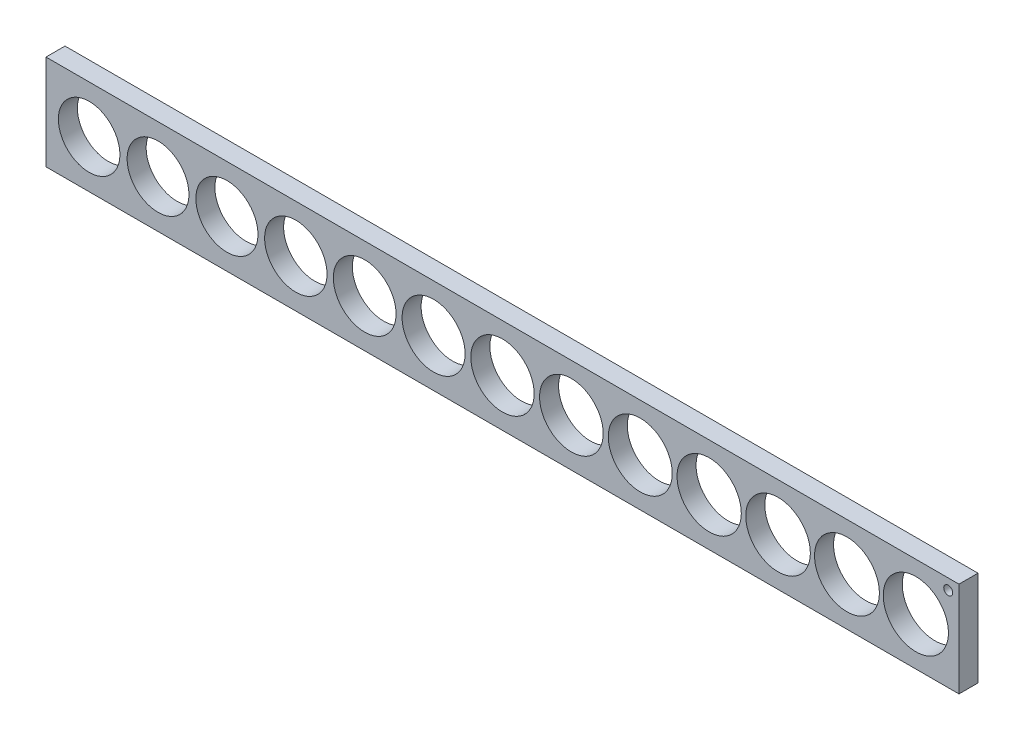
ISO-10303-21;
HEADER;
FILE_DESCRIPTION(('STEP AP214'),'2;1');
FILE_NAME('part.step','',(''),(''),'','','');
FILE_SCHEMA(('AUTOMOTIVE_DESIGN { 1 0 10303 214 1 1 1 1 }'));
ENDSEC;
DATA;
#1=APPLICATION_CONTEXT('core data for automotive mechanical design processes');
#2=APPLICATION_PROTOCOL_DEFINITION('international standard','automotive_design',2000,#1);
#3=PRODUCT_CONTEXT('',#1,'mechanical');
#4=PRODUCT('Part','Part','',(#3));
#5=PRODUCT_RELATED_PRODUCT_CATEGORY('part','',(#4));
#6=PRODUCT_DEFINITION_FORMATION('','',#4);
#7=PRODUCT_DEFINITION_CONTEXT('part definition',#1,'design');
#8=PRODUCT_DEFINITION('design','',#6,#7);
#9=PRODUCT_DEFINITION_SHAPE('','',#8);
#10=(LENGTH_UNIT() NAMED_UNIT(*) SI_UNIT(.MILLI.,.METRE.));
#11=(NAMED_UNIT(*) PLANE_ANGLE_UNIT() SI_UNIT($,.RADIAN.));
#12=(NAMED_UNIT(*) SI_UNIT($,.STERADIAN.) SOLID_ANGLE_UNIT());
#13=UNCERTAINTY_MEASURE_WITH_UNIT(LENGTH_MEASURE(1.E-05),#10,'distance_accuracy_value','');
#14=(GEOMETRIC_REPRESENTATION_CONTEXT(3) GLOBAL_UNCERTAINTY_ASSIGNED_CONTEXT((#13)) GLOBAL_UNIT_ASSIGNED_CONTEXT((#10,
#11,#12)) REPRESENTATION_CONTEXT('',''));
#15=CARTESIAN_POINT('',(0.,0.,0.));
#16=DIRECTION('',(0.,0.,1.));
#17=DIRECTION('',(1.,0.,0.));
#18=AXIS2_PLACEMENT_3D('',#15,#16,#17);
#19=CARTESIAN_POINT('',(0.,0.,6.35));
#20=DIRECTION('',(0.,0.,1.));
#21=DIRECTION('',(1.,0.,0.));
#22=AXIS2_PLACEMENT_3D('',#19,#20,#21);
#23=PLANE('',#22);
#24=CARTESIAN_POINT('',(-23.,0.,6.35));
#25=DIRECTION('',(0.,0.,1.));
#26=DIRECTION('',(-1.,0.,0.));
#27=AXIS2_PLACEMENT_3D('',#24,#25,#26);
#28=CIRCLE('',#27,10.5242);
#29=CARTESIAN_POINT('',(-33.5242,0.,6.35));
#30=VERTEX_POINT('',#29);
#31=EDGE_CURVE('E190',#30,#30,#28,.T.);
#32=ORIENTED_EDGE('',*,*,#31,.F.);
#33=EDGE_LOOP('',(#32));
#34=FACE_BOUND('',#33,.T.);
#35=CARTESIAN_POINT('',(-69.,0.,6.35));
#36=DIRECTION('',(0.,0.,1.));
#37=DIRECTION('',(-1.,0.,0.));
#38=AXIS2_PLACEMENT_3D('',#35,#36,#37);
#39=CIRCLE('',#38,10.4226);
#40=CARTESIAN_POINT('',(-79.4226,0.,6.35));
#41=VERTEX_POINT('',#40);
#42=EDGE_CURVE('E178',#41,#41,#39,.T.);
#43=ORIENTED_EDGE('',*,*,#42,.F.);
#44=EDGE_LOOP('',(#43));
#45=FACE_BOUND('',#44,.T.);
#46=CARTESIAN_POINT('',(-115.,0.,6.35));
#47=DIRECTION('',(0.,0.,1.));
#48=DIRECTION('',(-1.,0.,0.));
#49=AXIS2_PLACEMENT_3D('',#46,#47,#48);
#50=CIRCLE('',#49,10.321);
#51=CARTESIAN_POINT('',(-125.321,0.,6.35));
#52=VERTEX_POINT('',#51);
#53=EDGE_CURVE('E166',#52,#52,#50,.T.);
#54=ORIENTED_EDGE('',*,*,#53,.F.);
#55=EDGE_LOOP('',(#54));
#56=FACE_BOUND('',#55,.T.);
#57=CARTESIAN_POINT('',(138.,0.,6.35));
#58=DIRECTION('',(0.,0.,1.));
#59=DIRECTION('',(1.,0.,0.));
#60=AXIS2_PLACEMENT_3D('',#57,#58,#59);
#61=CIRCLE('',#60,10.8798);
#62=CARTESIAN_POINT('',(148.8798,0.,6.35));
#63=VERTEX_POINT('',#62);
#64=EDGE_CURVE('E154',#63,#63,#61,.T.);
#65=ORIENTED_EDGE('',*,*,#64,.F.);
#66=EDGE_LOOP('',(#65));
#67=FACE_BOUND('',#66,.T.);
#68=CARTESIAN_POINT('',(92.,0.,6.35));
#69=DIRECTION('',(0.,0.,1.));
#70=DIRECTION('',(1.,0.,0.));
#71=AXIS2_PLACEMENT_3D('',#68,#69,#70);
#72=CIRCLE('',#71,10.7782);
#73=CARTESIAN_POINT('',(102.7782,0.,6.35));
#74=VERTEX_POINT('',#73);
#75=EDGE_CURVE('E142',#74,#74,#72,.T.);
#76=ORIENTED_EDGE('',*,*,#75,.F.);
#77=EDGE_LOOP('',(#76));
#78=FACE_BOUND('',#77,.T.);
#79=CARTESIAN_POINT('',(46.,0.,6.35));
#80=DIRECTION('',(0.,0.,1.));
#81=DIRECTION('',(1.,0.,0.));
#82=AXIS2_PLACEMENT_3D('',#79,#80,#81);
#83=CIRCLE('',#82,10.6766);
#84=CARTESIAN_POINT('',(56.6766,0.,6.35));
#85=VERTEX_POINT('',#84);
#86=EDGE_CURVE('E130',#85,#85,#83,.T.);
#87=ORIENTED_EDGE('',*,*,#86,.F.);
#88=EDGE_LOOP('',(#87));
#89=FACE_BOUND('',#88,.T.);
#90=CARTESIAN_POINT('',(0.,0.,6.35));
#91=DIRECTION('',(0.,0.,1.));
#92=DIRECTION('',(1.,0.,0.));
#93=AXIS2_PLACEMENT_3D('',#90,#91,#92);
#94=CIRCLE('',#93,10.575);
#95=CARTESIAN_POINT('',(10.575,0.,6.35));
#96=VERTEX_POINT('',#95);
#97=EDGE_CURVE('E109',#96,#96,#94,.T.);
#98=ORIENTED_EDGE('',*,*,#97,.F.);
#99=EDGE_LOOP('',(#98));
#100=FACE_BOUND('',#99,.T.);
#101=DIRECTION('',(0.,1.,0.));
#102=VECTOR('',#101,1.);
#103=CARTESIAN_POINT('',(152.4,15.8749999999999,6.35));
#104=LINE('',#103,#102);
#105=CARTESIAN_POINT('',(152.4,-15.8750000000001,6.35));
#106=VERTEX_POINT('',#105);
#107=CARTESIAN_POINT('',(152.4,15.8749999999999,6.35));
#108=VERTEX_POINT('',#107);
#109=EDGE_CURVE('E94',#106,#108,#104,.T.);
#110=ORIENTED_EDGE('',*,*,#109,.T.);
#111=DIRECTION('',(-1.,0.,0.));
#112=VECTOR('',#111,1.);
#113=CARTESIAN_POINT('',(-152.4,15.8750000000001,6.35));
#114=LINE('',#113,#112);
#115=CARTESIAN_POINT('',(-152.4,15.8750000000001,6.35));
#116=VERTEX_POINT('',#115);
#117=EDGE_CURVE('E89',#108,#116,#114,.T.);
#118=ORIENTED_EDGE('',*,*,#117,.T.);
#119=DIRECTION('',(0.,-1.,0.));
#120=VECTOR('',#119,1.);
#121=CARTESIAN_POINT('',(-152.4,15.8750000000001,6.35));
#122=LINE('',#121,#120);
#123=CARTESIAN_POINT('',(-152.4,-15.8750000000001,6.35));
#124=VERTEX_POINT('',#123);
#125=EDGE_CURVE('E92',#116,#124,#122,.T.);
#126=ORIENTED_EDGE('',*,*,#125,.T.);
#127=DIRECTION('',(1.,0.,0.));
#128=VECTOR('',#127,1.);
#129=CARTESIAN_POINT('',(-152.4,-15.8750000000001,6.35));
#130=LINE('',#129,#128);
#131=EDGE_CURVE('E59',#124,#106,#130,.T.);
#132=ORIENTED_EDGE('',*,*,#131,.T.);
#133=EDGE_LOOP('',(#110,#118,#126,#132));
#134=FACE_BOUND('',#133,.T.);
#135=CARTESIAN_POINT('',(23.,0.,6.35));
#136=DIRECTION('',(0.,0.,1.));
#137=DIRECTION('',(1.,0.,0.));
#138=AXIS2_PLACEMENT_3D('',#135,#136,#137);
#139=CIRCLE('',#138,10.6258);
#140=CARTESIAN_POINT('',(33.6258,0.,6.35));
#141=VERTEX_POINT('',#140);
#142=EDGE_CURVE('E124',#141,#141,#139,.T.);
#143=ORIENTED_EDGE('',*,*,#142,.F.);
#144=EDGE_LOOP('',(#143));
#145=FACE_BOUND('',#144,.T.);
#146=CARTESIAN_POINT('',(69.,0.,6.35));
#147=DIRECTION('',(0.,0.,1.));
#148=DIRECTION('',(1.,0.,0.));
#149=AXIS2_PLACEMENT_3D('',#146,#147,#148);
#150=CIRCLE('',#149,10.7274);
#151=CARTESIAN_POINT('',(79.7274,0.,6.35));
#152=VERTEX_POINT('',#151);
#153=EDGE_CURVE('E136',#152,#152,#150,.T.);
#154=ORIENTED_EDGE('',*,*,#153,.F.);
#155=EDGE_LOOP('',(#154));
#156=FACE_BOUND('',#155,.T.);
#157=CARTESIAN_POINT('',(115.,0.,6.35));
#158=DIRECTION('',(0.,0.,1.));
#159=DIRECTION('',(1.,0.,0.));
#160=AXIS2_PLACEMENT_3D('',#157,#158,#159);
#161=CIRCLE('',#160,10.829);
#162=CARTESIAN_POINT('',(125.829,0.,6.35));
#163=VERTEX_POINT('',#162);
#164=EDGE_CURVE('E148',#163,#163,#161,.T.);
#165=ORIENTED_EDGE('',*,*,#164,.F.);
#166=EDGE_LOOP('',(#165));
#167=FACE_BOUND('',#166,.T.);
#168=CARTESIAN_POINT('',(-138.,0.,6.35));
#169=DIRECTION('',(0.,0.,1.));
#170=DIRECTION('',(-1.,0.,0.));
#171=AXIS2_PLACEMENT_3D('',#168,#169,#170);
#172=CIRCLE('',#171,10.2702);
#173=CARTESIAN_POINT('',(-148.2702,0.,6.35));
#174=VERTEX_POINT('',#173);
#175=EDGE_CURVE('E160',#174,#174,#172,.T.);
#176=ORIENTED_EDGE('',*,*,#175,.F.);
#177=EDGE_LOOP('',(#176));
#178=FACE_BOUND('',#177,.T.);
#179=CARTESIAN_POINT('',(-92.,0.,6.35));
#180=DIRECTION('',(0.,0.,1.));
#181=DIRECTION('',(-1.,0.,0.));
#182=AXIS2_PLACEMENT_3D('',#179,#180,#181);
#183=CIRCLE('',#182,10.3718);
#184=CARTESIAN_POINT('',(-102.3718,0.,6.35));
#185=VERTEX_POINT('',#184);
#186=EDGE_CURVE('E172',#185,#185,#183,.T.);
#187=ORIENTED_EDGE('',*,*,#186,.F.);
#188=EDGE_LOOP('',(#187));
#189=FACE_BOUND('',#188,.T.);
#190=CARTESIAN_POINT('',(-46.,0.,6.35));
#191=DIRECTION('',(0.,0.,1.));
#192=DIRECTION('',(-1.,0.,0.));
#193=AXIS2_PLACEMENT_3D('',#190,#191,#192);
#194=CIRCLE('',#193,10.4734);
#195=CARTESIAN_POINT('',(-56.4734,0.,6.35));
#196=VERTEX_POINT('',#195);
#197=EDGE_CURVE('E184',#196,#196,#194,.T.);
#198=ORIENTED_EDGE('',*,*,#197,.F.);
#199=EDGE_LOOP('',(#198));
#200=FACE_BOUND('',#199,.T.);
#201=CARTESIAN_POINT('',(148.807897551572,12.2828975515723,6.35));
#202=DIRECTION('',(0.,0.,1.));
#203=DIRECTION('',(1.,0.,0.));
#204=AXIS2_PLACEMENT_3D('',#201,#202,#203);
#205=CIRCLE('',#204,1.5);
#206=CARTESIAN_POINT('',(150.307897551572,12.2828975515723,6.35));
#207=VERTEX_POINT('',#206);
#208=EDGE_CURVE('E196',#207,#207,#205,.T.);
#209=ORIENTED_EDGE('',*,*,#208,.F.);
#210=EDGE_LOOP('',(#209));
#211=FACE_BOUND('',#210,.T.);
#212=ADVANCED_FACE('F42',(#34,#45,#56,#67,#78,#89,#100,#134,#145,#156,#167,#178,#189,#200,#211),
#23,.T.);
#213=CARTESIAN_POINT('',(0.,0.,0.));
#214=DIRECTION('',(0.,0.,1.));
#215=DIRECTION('',(1.,0.,0.));
#216=AXIS2_PLACEMENT_3D('',#213,#214,#215);
#217=PLANE('',#216);
#218=DIRECTION('',(0.,1.,0.));
#219=VECTOR('',#218,1.);
#220=CARTESIAN_POINT('',(152.4,15.8749999999999,0.));
#221=LINE('',#220,#219);
#222=CARTESIAN_POINT('',(152.4,-15.8750000000001,0.));
#223=VERTEX_POINT('',#222);
#224=CARTESIAN_POINT('',(152.4,15.8749999999999,0.));
#225=VERTEX_POINT('',#224);
#226=EDGE_CURVE('E106',#223,#225,#221,.T.);
#227=ORIENTED_EDGE('',*,*,#226,.F.);
#228=DIRECTION('',(1.,0.,0.));
#229=VECTOR('',#228,1.);
#230=CARTESIAN_POINT('',(-152.4,-15.8750000000001,0.));
#231=LINE('',#230,#229);
#232=CARTESIAN_POINT('',(-152.4,-15.8750000000001,0.));
#233=VERTEX_POINT('',#232);
#234=EDGE_CURVE('E82',#233,#223,#231,.T.);
#235=ORIENTED_EDGE('',*,*,#234,.F.);
#236=DIRECTION('',(0.,-1.,0.));
#237=VECTOR('',#236,1.);
#238=CARTESIAN_POINT('',(-152.4,15.8750000000001,0.));
#239=LINE('',#238,#237);
#240=CARTESIAN_POINT('',(-152.4,15.8750000000001,0.));
#241=VERTEX_POINT('',#240);
#242=EDGE_CURVE('E76',#241,#233,#239,.T.);
#243=ORIENTED_EDGE('',*,*,#242,.F.);
#244=DIRECTION('',(-1.,0.,0.));
#245=VECTOR('',#244,1.);
#246=CARTESIAN_POINT('',(-152.4,15.8750000000001,0.));
#247=LINE('',#246,#245);
#248=EDGE_CURVE('E98',#225,#241,#247,.T.);
#249=ORIENTED_EDGE('',*,*,#248,.F.);
#250=EDGE_LOOP('',(#227,#235,#243,#249));
#251=FACE_BOUND('',#250,.T.);
#252=CARTESIAN_POINT('',(0.,0.,0.));
#253=DIRECTION('',(0.,0.,1.));
#254=DIRECTION('',(1.,0.,0.));
#255=AXIS2_PLACEMENT_3D('',#252,#253,#254);
#256=CIRCLE('',#255,10.575);
#257=CARTESIAN_POINT('',(10.575,0.,0.));
#258=VERTEX_POINT('',#257);
#259=EDGE_CURVE('E121',#258,#258,#256,.T.);
#260=ORIENTED_EDGE('',*,*,#259,.T.);
#261=EDGE_LOOP('',(#260));
#262=FACE_BOUND('',#261,.T.);
#263=CARTESIAN_POINT('',(23.,0.,0.));
#264=DIRECTION('',(0.,0.,1.));
#265=DIRECTION('',(1.,0.,0.));
#266=AXIS2_PLACEMENT_3D('',#263,#264,#265);
#267=CIRCLE('',#266,10.6258);
#268=CARTESIAN_POINT('',(33.6258,0.,0.));
#269=VERTEX_POINT('',#268);
#270=EDGE_CURVE('E127',#269,#269,#267,.T.);
#271=ORIENTED_EDGE('',*,*,#270,.T.);
#272=EDGE_LOOP('',(#271));
#273=FACE_BOUND('',#272,.T.);
#274=CARTESIAN_POINT('',(46.,0.,0.));
#275=DIRECTION('',(0.,0.,1.));
#276=DIRECTION('',(1.,0.,0.));
#277=AXIS2_PLACEMENT_3D('',#274,#275,#276);
#278=CIRCLE('',#277,10.6766);
#279=CARTESIAN_POINT('',(56.6766,0.,0.));
#280=VERTEX_POINT('',#279);
#281=EDGE_CURVE('E133',#280,#280,#278,.T.);
#282=ORIENTED_EDGE('',*,*,#281,.T.);
#283=EDGE_LOOP('',(#282));
#284=FACE_BOUND('',#283,.T.);
#285=CARTESIAN_POINT('',(69.,0.,0.));
#286=DIRECTION('',(0.,0.,1.));
#287=DIRECTION('',(1.,0.,0.));
#288=AXIS2_PLACEMENT_3D('',#285,#286,#287);
#289=CIRCLE('',#288,10.7274);
#290=CARTESIAN_POINT('',(79.7274,0.,0.));
#291=VERTEX_POINT('',#290);
#292=EDGE_CURVE('E139',#291,#291,#289,.T.);
#293=ORIENTED_EDGE('',*,*,#292,.T.);
#294=EDGE_LOOP('',(#293));
#295=FACE_BOUND('',#294,.T.);
#296=CARTESIAN_POINT('',(92.,0.,0.));
#297=DIRECTION('',(0.,0.,1.));
#298=DIRECTION('',(1.,0.,0.));
#299=AXIS2_PLACEMENT_3D('',#296,#297,#298);
#300=CIRCLE('',#299,10.7782);
#301=CARTESIAN_POINT('',(102.7782,0.,0.));
#302=VERTEX_POINT('',#301);
#303=EDGE_CURVE('E145',#302,#302,#300,.T.);
#304=ORIENTED_EDGE('',*,*,#303,.T.);
#305=EDGE_LOOP('',(#304));
#306=FACE_BOUND('',#305,.T.);
#307=CARTESIAN_POINT('',(115.,0.,0.));
#308=DIRECTION('',(0.,0.,1.));
#309=DIRECTION('',(1.,0.,0.));
#310=AXIS2_PLACEMENT_3D('',#307,#308,#309);
#311=CIRCLE('',#310,10.829);
#312=CARTESIAN_POINT('',(125.829,0.,0.));
#313=VERTEX_POINT('',#312);
#314=EDGE_CURVE('E151',#313,#313,#311,.T.);
#315=ORIENTED_EDGE('',*,*,#314,.T.);
#316=EDGE_LOOP('',(#315));
#317=FACE_BOUND('',#316,.T.);
#318=CARTESIAN_POINT('',(138.,0.,0.));
#319=DIRECTION('',(0.,0.,1.));
#320=DIRECTION('',(1.,0.,0.));
#321=AXIS2_PLACEMENT_3D('',#318,#319,#320);
#322=CIRCLE('',#321,10.8798);
#323=CARTESIAN_POINT('',(148.8798,0.,0.));
#324=VERTEX_POINT('',#323);
#325=EDGE_CURVE('E157',#324,#324,#322,.T.);
#326=ORIENTED_EDGE('',*,*,#325,.T.);
#327=EDGE_LOOP('',(#326));
#328=FACE_BOUND('',#327,.T.);
#329=CARTESIAN_POINT('',(-138.,0.,0.));
#330=DIRECTION('',(0.,0.,1.));
#331=DIRECTION('',(-1.,0.,0.));
#332=AXIS2_PLACEMENT_3D('',#329,#330,#331);
#333=CIRCLE('',#332,10.2702);
#334=CARTESIAN_POINT('',(-148.2702,0.,0.));
#335=VERTEX_POINT('',#334);
#336=EDGE_CURVE('E163',#335,#335,#333,.T.);
#337=ORIENTED_EDGE('',*,*,#336,.T.);
#338=EDGE_LOOP('',(#337));
#339=FACE_BOUND('',#338,.T.);
#340=CARTESIAN_POINT('',(-115.,0.,0.));
#341=DIRECTION('',(0.,0.,1.));
#342=DIRECTION('',(-1.,0.,0.));
#343=AXIS2_PLACEMENT_3D('',#340,#341,#342);
#344=CIRCLE('',#343,10.321);
#345=CARTESIAN_POINT('',(-125.321,0.,0.));
#346=VERTEX_POINT('',#345);
#347=EDGE_CURVE('E169',#346,#346,#344,.T.);
#348=ORIENTED_EDGE('',*,*,#347,.T.);
#349=EDGE_LOOP('',(#348));
#350=FACE_BOUND('',#349,.T.);
#351=CARTESIAN_POINT('',(-92.,0.,0.));
#352=DIRECTION('',(0.,0.,1.));
#353=DIRECTION('',(-1.,0.,0.));
#354=AXIS2_PLACEMENT_3D('',#351,#352,#353);
#355=CIRCLE('',#354,10.3718);
#356=CARTESIAN_POINT('',(-102.3718,0.,0.));
#357=VERTEX_POINT('',#356);
#358=EDGE_CURVE('E175',#357,#357,#355,.T.);
#359=ORIENTED_EDGE('',*,*,#358,.T.);
#360=EDGE_LOOP('',(#359));
#361=FACE_BOUND('',#360,.T.);
#362=CARTESIAN_POINT('',(-69.,0.,0.));
#363=DIRECTION('',(0.,0.,1.));
#364=DIRECTION('',(-1.,0.,0.));
#365=AXIS2_PLACEMENT_3D('',#362,#363,#364);
#366=CIRCLE('',#365,10.4226);
#367=CARTESIAN_POINT('',(-79.4226,0.,0.));
#368=VERTEX_POINT('',#367);
#369=EDGE_CURVE('E181',#368,#368,#366,.T.);
#370=ORIENTED_EDGE('',*,*,#369,.T.);
#371=EDGE_LOOP('',(#370));
#372=FACE_BOUND('',#371,.T.);
#373=CARTESIAN_POINT('',(-46.,0.,0.));
#374=DIRECTION('',(0.,0.,1.));
#375=DIRECTION('',(-1.,0.,0.));
#376=AXIS2_PLACEMENT_3D('',#373,#374,#375);
#377=CIRCLE('',#376,10.4734);
#378=CARTESIAN_POINT('',(-56.4734,0.,0.));
#379=VERTEX_POINT('',#378);
#380=EDGE_CURVE('E187',#379,#379,#377,.T.);
#381=ORIENTED_EDGE('',*,*,#380,.T.);
#382=EDGE_LOOP('',(#381));
#383=FACE_BOUND('',#382,.T.);
#384=CARTESIAN_POINT('',(-23.,0.,0.));
#385=DIRECTION('',(0.,0.,1.));
#386=DIRECTION('',(-1.,0.,0.));
#387=AXIS2_PLACEMENT_3D('',#384,#385,#386);
#388=CIRCLE('',#387,10.5242);
#389=CARTESIAN_POINT('',(-33.5242,0.,0.));
#390=VERTEX_POINT('',#389);
#391=EDGE_CURVE('E193',#390,#390,#388,.T.);
#392=ORIENTED_EDGE('',*,*,#391,.T.);
#393=EDGE_LOOP('',(#392));
#394=FACE_BOUND('',#393,.T.);
#395=CARTESIAN_POINT('',(148.807897551572,12.2828975515723,0.));
#396=DIRECTION('',(0.,0.,1.));
#397=DIRECTION('',(1.,0.,0.));
#398=AXIS2_PLACEMENT_3D('',#395,#396,#397);
#399=CIRCLE('',#398,1.5);
#400=CARTESIAN_POINT('',(150.307897551572,12.2828975515723,0.));
#401=VERTEX_POINT('',#400);
#402=EDGE_CURVE('E199',#401,#401,#399,.T.);
#403=ORIENTED_EDGE('',*,*,#402,.T.);
#404=EDGE_LOOP('',(#403));
#405=FACE_BOUND('',#404,.T.);
#406=ADVANCED_FACE('F117',(#251,#262,#273,#284,#295,#306,#317,#328,#339,#350,#361,#372,#383,
#394,#405),#217,.F.);
#407=CARTESIAN_POINT('',(152.4,15.8749999999999,6.35));
#408=DIRECTION('',(-1.,0.,0.));
#409=DIRECTION('',(0.,-1.,0.));
#410=AXIS2_PLACEMENT_3D('',#407,#408,#409);
#411=PLANE('',#410);
#412=ORIENTED_EDGE('',*,*,#226,.T.);
#413=DIRECTION('',(0.,0.,-1.));
#414=VECTOR('',#413,1.);
#415=CARTESIAN_POINT('',(152.4,15.8749999999999,6.35));
#416=LINE('',#415,#414);
#417=EDGE_CURVE('E11',#108,#225,#416,.T.);
#418=ORIENTED_EDGE('',*,*,#417,.F.);
#419=ORIENTED_EDGE('',*,*,#109,.F.);
#420=DIRECTION('',(0.,0.,-1.));
#421=VECTOR('',#420,1.);
#422=CARTESIAN_POINT('',(152.4,-15.8750000000001,6.35));
#423=LINE('',#422,#421);
#424=EDGE_CURVE('E102',#106,#223,#423,.T.);
#425=ORIENTED_EDGE('',*,*,#424,.T.);
#426=EDGE_LOOP('',(#412,#418,#419,#425));
#427=FACE_BOUND('',#426,.T.);
#428=ADVANCED_FACE('F44',(#427),#411,.F.);
#429=CARTESIAN_POINT('',(-152.4,15.8750000000001,6.35));
#430=DIRECTION('',(0.,-1.,0.));
#431=DIRECTION('',(1.,0.,0.));
#432=AXIS2_PLACEMENT_3D('',#429,#430,#431);
#433=PLANE('',#432);
#434=ORIENTED_EDGE('',*,*,#248,.T.);
#435=DIRECTION('',(0.,0.,-1.));
#436=VECTOR('',#435,1.);
#437=CARTESIAN_POINT('',(-152.4,15.8750000000001,6.35));
#438=LINE('',#437,#436);
#439=EDGE_CURVE('E51',#116,#241,#438,.T.);
#440=ORIENTED_EDGE('',*,*,#439,.F.);
#441=ORIENTED_EDGE('',*,*,#117,.F.);
#442=ORIENTED_EDGE('',*,*,#417,.T.);
#443=EDGE_LOOP('',(#434,#440,#441,#442));
#444=FACE_BOUND('',#443,.T.);
#445=ADVANCED_FACE('F97',(#444),#433,.F.);
#446=CARTESIAN_POINT('',(-152.4,15.8750000000001,6.35));
#447=DIRECTION('',(1.,0.,0.));
#448=DIRECTION('',(0.,0.,-1.));
#449=AXIS2_PLACEMENT_3D('',#446,#447,#448);
#450=PLANE('',#449);
#451=ORIENTED_EDGE('',*,*,#242,.T.);
#452=DIRECTION('',(0.,0.,-1.));
#453=VECTOR('',#452,1.);
#454=CARTESIAN_POINT('',(-152.4,-15.8750000000001,6.35));
#455=LINE('',#454,#453);
#456=EDGE_CURVE('E99',#124,#233,#455,.T.);
#457=ORIENTED_EDGE('',*,*,#456,.F.);
#458=ORIENTED_EDGE('',*,*,#125,.F.);
#459=ORIENTED_EDGE('',*,*,#439,.T.);
#460=EDGE_LOOP('',(#451,#457,#458,#459));
#461=FACE_BOUND('',#460,.T.);
#462=ADVANCED_FACE('F100',(#461),#450,.F.);
#463=CARTESIAN_POINT('',(-152.4,-15.8750000000001,6.35));
#464=DIRECTION('',(0.,1.,0.));
#465=DIRECTION('',(-1.,0.,0.));
#466=AXIS2_PLACEMENT_3D('',#463,#464,#465);
#467=PLANE('',#466);
#468=ORIENTED_EDGE('',*,*,#234,.T.);
#469=ORIENTED_EDGE('',*,*,#424,.F.);
#470=ORIENTED_EDGE('',*,*,#131,.F.);
#471=ORIENTED_EDGE('',*,*,#456,.T.);
#472=EDGE_LOOP('',(#468,#469,#470,#471));
#473=FACE_BOUND('',#472,.T.);
#474=ADVANCED_FACE('F114',(#473),#467,.F.);
#475=CARTESIAN_POINT('',(0.,0.,6.35));
#476=DIRECTION('',(0.,0.,-1.));
#477=DIRECTION('',(-1.,0.,0.));
#478=AXIS2_PLACEMENT_3D('',#475,#476,#477);
#479=CYLINDRICAL_SURFACE('',#478,10.575);
#480=ORIENTED_EDGE('',*,*,#97,.T.);
#481=EDGE_LOOP('',(#480));
#482=FACE_BOUND('',#481,.T.);
#483=ORIENTED_EDGE('',*,*,#259,.F.);
#484=EDGE_LOOP('',(#483));
#485=FACE_BOUND('',#484,.T.);
#486=ADVANCED_FACE('F218',(#482,#485),#479,.F.);
#487=CARTESIAN_POINT('',(23.,0.,6.35));
#488=DIRECTION('',(0.,0.,-1.));
#489=DIRECTION('',(-1.,0.,0.));
#490=AXIS2_PLACEMENT_3D('',#487,#488,#489);
#491=CYLINDRICAL_SURFACE('',#490,10.6258);
#492=ORIENTED_EDGE('',*,*,#142,.T.);
#493=EDGE_LOOP('',(#492));
#494=FACE_BOUND('',#493,.T.);
#495=ORIENTED_EDGE('',*,*,#270,.F.);
#496=EDGE_LOOP('',(#495));
#497=FACE_BOUND('',#496,.T.);
#498=ADVANCED_FACE('F263',(#494,#497),#491,.F.);
#499=CARTESIAN_POINT('',(46.,0.,6.35));
#500=DIRECTION('',(0.,0.,-1.));
#501=DIRECTION('',(-1.,0.,0.));
#502=AXIS2_PLACEMENT_3D('',#499,#500,#501);
#503=CYLINDRICAL_SURFACE('',#502,10.6766);
#504=ORIENTED_EDGE('',*,*,#86,.T.);
#505=EDGE_LOOP('',(#504));
#506=FACE_BOUND('',#505,.T.);
#507=ORIENTED_EDGE('',*,*,#281,.F.);
#508=EDGE_LOOP('',(#507));
#509=FACE_BOUND('',#508,.T.);
#510=ADVANCED_FACE('F271',(#506,#509),#503,.F.);
#511=CARTESIAN_POINT('',(69.,0.,6.35));
#512=DIRECTION('',(0.,0.,-1.));
#513=DIRECTION('',(-1.,0.,0.));
#514=AXIS2_PLACEMENT_3D('',#511,#512,#513);
#515=CYLINDRICAL_SURFACE('',#514,10.7274);
#516=ORIENTED_EDGE('',*,*,#153,.T.);
#517=EDGE_LOOP('',(#516));
#518=FACE_BOUND('',#517,.T.);
#519=ORIENTED_EDGE('',*,*,#292,.F.);
#520=EDGE_LOOP('',(#519));
#521=FACE_BOUND('',#520,.T.);
#522=ADVANCED_FACE('F279',(#518,#521),#515,.F.);
#523=CARTESIAN_POINT('',(92.,0.,6.35));
#524=DIRECTION('',(0.,0.,-1.));
#525=DIRECTION('',(-1.,0.,0.));
#526=AXIS2_PLACEMENT_3D('',#523,#524,#525);
#527=CYLINDRICAL_SURFACE('',#526,10.7782);
#528=ORIENTED_EDGE('',*,*,#75,.T.);
#529=EDGE_LOOP('',(#528));
#530=FACE_BOUND('',#529,.T.);
#531=ORIENTED_EDGE('',*,*,#303,.F.);
#532=EDGE_LOOP('',(#531));
#533=FACE_BOUND('',#532,.T.);
#534=ADVANCED_FACE('F288',(#530,#533),#527,.F.);
#535=CARTESIAN_POINT('',(115.,0.,6.35));
#536=DIRECTION('',(0.,0.,-1.));
#537=DIRECTION('',(-1.,0.,0.));
#538=AXIS2_PLACEMENT_3D('',#535,#536,#537);
#539=CYLINDRICAL_SURFACE('',#538,10.829);
#540=ORIENTED_EDGE('',*,*,#164,.T.);
#541=EDGE_LOOP('',(#540));
#542=FACE_BOUND('',#541,.T.);
#543=ORIENTED_EDGE('',*,*,#314,.F.);
#544=EDGE_LOOP('',(#543));
#545=FACE_BOUND('',#544,.T.);
#546=ADVANCED_FACE('F297',(#542,#545),#539,.F.);
#547=CARTESIAN_POINT('',(138.,0.,6.35));
#548=DIRECTION('',(0.,0.,-1.));
#549=DIRECTION('',(-1.,0.,0.));
#550=AXIS2_PLACEMENT_3D('',#547,#548,#549);
#551=CYLINDRICAL_SURFACE('',#550,10.8798);
#552=ORIENTED_EDGE('',*,*,#64,.T.);
#553=EDGE_LOOP('',(#552));
#554=FACE_BOUND('',#553,.T.);
#555=ORIENTED_EDGE('',*,*,#325,.F.);
#556=EDGE_LOOP('',(#555));
#557=FACE_BOUND('',#556,.T.);
#558=ADVANCED_FACE('F306',(#554,#557),#551,.F.);
#559=CARTESIAN_POINT('',(-138.,0.,6.35));
#560=DIRECTION('',(0.,0.,-1.));
#561=DIRECTION('',(-1.,0.,0.));
#562=AXIS2_PLACEMENT_3D('',#559,#560,#561);
#563=CYLINDRICAL_SURFACE('',#562,10.2702);
#564=ORIENTED_EDGE('',*,*,#175,.T.);
#565=EDGE_LOOP('',(#564));
#566=FACE_BOUND('',#565,.T.);
#567=ORIENTED_EDGE('',*,*,#336,.F.);
#568=EDGE_LOOP('',(#567));
#569=FACE_BOUND('',#568,.T.);
#570=ADVANCED_FACE('F315',(#566,#569),#563,.F.);
#571=CARTESIAN_POINT('',(-115.,0.,6.35));
#572=DIRECTION('',(0.,0.,-1.));
#573=DIRECTION('',(-1.,0.,0.));
#574=AXIS2_PLACEMENT_3D('',#571,#572,#573);
#575=CYLINDRICAL_SURFACE('',#574,10.321);
#576=ORIENTED_EDGE('',*,*,#53,.T.);
#577=EDGE_LOOP('',(#576));
#578=FACE_BOUND('',#577,.T.);
#579=ORIENTED_EDGE('',*,*,#347,.F.);
#580=EDGE_LOOP('',(#579));
#581=FACE_BOUND('',#580,.T.);
#582=ADVANCED_FACE('F324',(#578,#581),#575,.F.);
#583=CARTESIAN_POINT('',(-92.,0.,6.35));
#584=DIRECTION('',(0.,0.,-1.));
#585=DIRECTION('',(-1.,0.,0.));
#586=AXIS2_PLACEMENT_3D('',#583,#584,#585);
#587=CYLINDRICAL_SURFACE('',#586,10.3718);
#588=ORIENTED_EDGE('',*,*,#186,.T.);
#589=EDGE_LOOP('',(#588));
#590=FACE_BOUND('',#589,.T.);
#591=ORIENTED_EDGE('',*,*,#358,.F.);
#592=EDGE_LOOP('',(#591));
#593=FACE_BOUND('',#592,.T.);
#594=ADVANCED_FACE('F333',(#590,#593),#587,.F.);
#595=CARTESIAN_POINT('',(-69.,0.,6.35));
#596=DIRECTION('',(0.,0.,-1.));
#597=DIRECTION('',(-1.,0.,0.));
#598=AXIS2_PLACEMENT_3D('',#595,#596,#597);
#599=CYLINDRICAL_SURFACE('',#598,10.4226);
#600=ORIENTED_EDGE('',*,*,#42,.T.);
#601=EDGE_LOOP('',(#600));
#602=FACE_BOUND('',#601,.T.);
#603=ORIENTED_EDGE('',*,*,#369,.F.);
#604=EDGE_LOOP('',(#603));
#605=FACE_BOUND('',#604,.T.);
#606=ADVANCED_FACE('F342',(#602,#605),#599,.F.);
#607=CARTESIAN_POINT('',(-46.,0.,6.35));
#608=DIRECTION('',(0.,0.,-1.));
#609=DIRECTION('',(-1.,0.,0.));
#610=AXIS2_PLACEMENT_3D('',#607,#608,#609);
#611=CYLINDRICAL_SURFACE('',#610,10.4734);
#612=ORIENTED_EDGE('',*,*,#197,.T.);
#613=EDGE_LOOP('',(#612));
#614=FACE_BOUND('',#613,.T.);
#615=ORIENTED_EDGE('',*,*,#380,.F.);
#616=EDGE_LOOP('',(#615));
#617=FACE_BOUND('',#616,.T.);
#618=ADVANCED_FACE('F351',(#614,#617),#611,.F.);
#619=CARTESIAN_POINT('',(-23.,0.,6.35));
#620=DIRECTION('',(0.,0.,-1.));
#621=DIRECTION('',(-1.,0.,0.));
#622=AXIS2_PLACEMENT_3D('',#619,#620,#621);
#623=CYLINDRICAL_SURFACE('',#622,10.5242);
#624=ORIENTED_EDGE('',*,*,#31,.T.);
#625=EDGE_LOOP('',(#624));
#626=FACE_BOUND('',#625,.T.);
#627=ORIENTED_EDGE('',*,*,#391,.F.);
#628=EDGE_LOOP('',(#627));
#629=FACE_BOUND('',#628,.T.);
#630=ADVANCED_FACE('F360',(#626,#629),#623,.F.);
#631=CARTESIAN_POINT('',(148.807897551572,12.2828975515723,6.35));
#632=DIRECTION('',(0.,0.,-1.));
#633=DIRECTION('',(-1.,0.,0.));
#634=AXIS2_PLACEMENT_3D('',#631,#632,#633);
#635=CYLINDRICAL_SURFACE('',#634,1.5);
#636=ORIENTED_EDGE('',*,*,#208,.T.);
#637=EDGE_LOOP('',(#636));
#638=FACE_BOUND('',#637,.T.);
#639=ORIENTED_EDGE('',*,*,#402,.F.);
#640=EDGE_LOOP('',(#639));
#641=FACE_BOUND('',#640,.T.);
#642=ADVANCED_FACE('F205',(#638,#641),#635,.F.);
#643=CLOSED_SHELL('',(#212,#406,#428,#445,#462,#474,#486,#498,#510,#522,#534,#546,#558,#570,
#582,#594,#606,#618,#630,#642));
#644=MANIFOLD_SOLID_BREP('B2',#643);
#645=ADVANCED_BREP_SHAPE_REPRESENTATION('',(#18,#644),#14);
#646=SHAPE_DEFINITION_REPRESENTATION(#9,#645);
ENDSEC;
END-ISO-10303-21;
